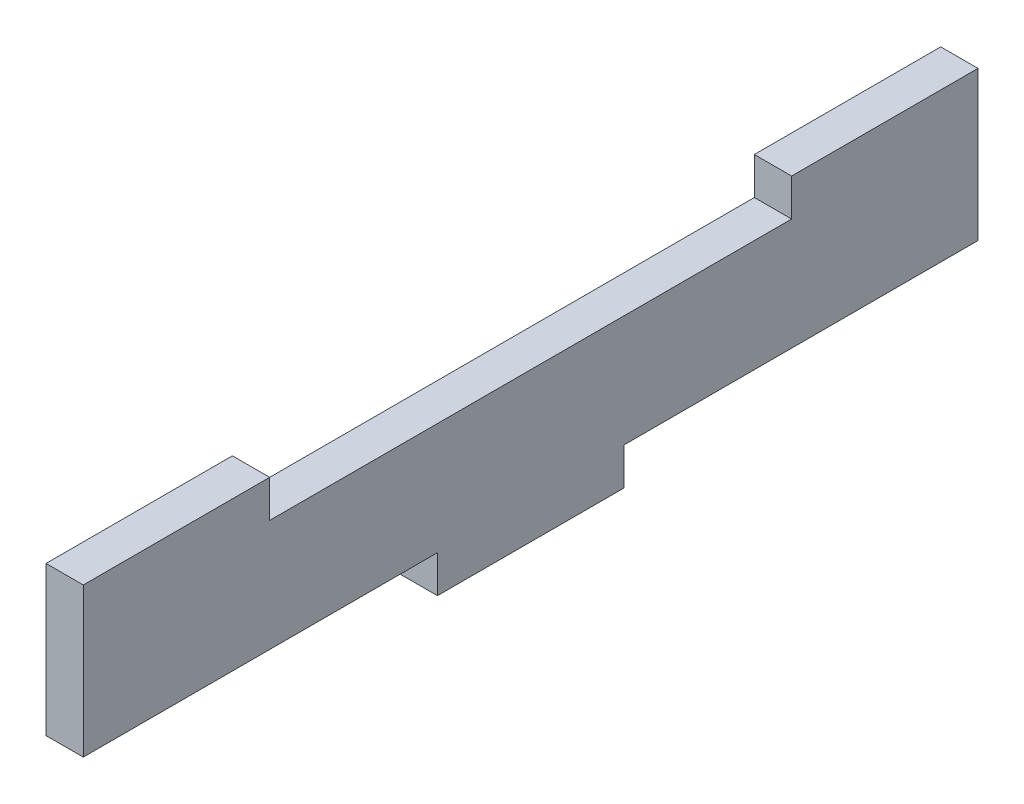
ISO-10303-21;
HEADER;
FILE_DESCRIPTION(('STEP AP214'),'2;1');
FILE_NAME('part.step','',(''),(''),'','','');
FILE_SCHEMA(('AUTOMOTIVE_DESIGN { 1 0 10303 214 1 1 1 1 }'));
ENDSEC;
DATA;
#1=APPLICATION_CONTEXT('core data for automotive mechanical design processes');
#2=APPLICATION_PROTOCOL_DEFINITION('international standard','automotive_design',2000,#1);
#3=PRODUCT_CONTEXT('',#1,'mechanical');
#4=PRODUCT('Part','Part','',(#3));
#5=PRODUCT_RELATED_PRODUCT_CATEGORY('part','',(#4));
#6=PRODUCT_DEFINITION_FORMATION('','',#4);
#7=PRODUCT_DEFINITION_CONTEXT('part definition',#1,'design');
#8=PRODUCT_DEFINITION('design','',#6,#7);
#9=PRODUCT_DEFINITION_SHAPE('','',#8);
#10=(LENGTH_UNIT() NAMED_UNIT(*) SI_UNIT(.MILLI.,.METRE.));
#11=(NAMED_UNIT(*) PLANE_ANGLE_UNIT() SI_UNIT($,.RADIAN.));
#12=(NAMED_UNIT(*) SI_UNIT($,.STERADIAN.) SOLID_ANGLE_UNIT());
#13=UNCERTAINTY_MEASURE_WITH_UNIT(LENGTH_MEASURE(1.E-05),#10,'distance_accuracy_value','');
#14=(GEOMETRIC_REPRESENTATION_CONTEXT(3) GLOBAL_UNCERTAINTY_ASSIGNED_CONTEXT((#13)) GLOBAL_UNIT_ASSIGNED_CONTEXT((#10,
#11,#12)) REPRESENTATION_CONTEXT('',''));
#15=CARTESIAN_POINT('',(0.,0.,0.));
#16=DIRECTION('',(0.,0.,1.));
#17=DIRECTION('',(1.,0.,0.));
#18=AXIS2_PLACEMENT_3D('',#15,#16,#17);
#19=CARTESIAN_POINT('',(5.,15.,120.));
#20=DIRECTION('',(0.,0.,-1.));
#21=DIRECTION('',(-1.,0.,0.));
#22=AXIS2_PLACEMENT_3D('',#19,#20,#21);
#23=PLANE('',#22);
#24=DIRECTION('',(0.,-1.,0.));
#25=VECTOR('',#24,1.);
#26=CARTESIAN_POINT('',(0.,15.,120.));
#27=LINE('',#26,#25);
#28=CARTESIAN_POINT('',(0.,20.,120.));
#29=VERTEX_POINT('',#28);
#30=CARTESIAN_POINT('',(0.,0.,120.));
#31=VERTEX_POINT('',#30);
#32=EDGE_CURVE('E99',#29,#31,#27,.T.);
#33=ORIENTED_EDGE('',*,*,#32,.T.);
#34=DIRECTION('',(-1.,0.,0.));
#35=VECTOR('',#34,1.);
#36=CARTESIAN_POINT('',(5.,0.,120.));
#37=LINE('',#36,#35);
#38=CARTESIAN_POINT('',(5.,0.,120.));
#39=VERTEX_POINT('',#38);
#40=EDGE_CURVE('E11',#39,#31,#37,.T.);
#41=ORIENTED_EDGE('',*,*,#40,.F.);
#42=DIRECTION('',(0.,-1.,0.));
#43=VECTOR('',#42,1.);
#44=CARTESIAN_POINT('',(5.,15.,120.));
#45=LINE('',#44,#43);
#46=CARTESIAN_POINT('',(5.,20.,120.));
#47=VERTEX_POINT('',#46);
#48=EDGE_CURVE('E105',#47,#39,#45,.T.);
#49=ORIENTED_EDGE('',*,*,#48,.F.);
#50=DIRECTION('',(-1.,0.,0.));
#51=VECTOR('',#50,1.);
#52=CARTESIAN_POINT('',(5.,20.,120.));
#53=LINE('',#52,#51);
#54=EDGE_CURVE('E151',#47,#29,#53,.T.);
#55=ORIENTED_EDGE('',*,*,#54,.T.);
#56=EDGE_LOOP('',(#33,#41,#49,#55));
#57=FACE_BOUND('',#56,.T.);
#58=ADVANCED_FACE('F35',(#57),#23,.F.);
#59=CARTESIAN_POINT('',(5.,0.,120.));
#60=DIRECTION('',(0.,1.,0.));
#61=DIRECTION('',(0.,0.,1.));
#62=AXIS2_PLACEMENT_3D('',#59,#60,#61);
#63=PLANE('',#62);
#64=DIRECTION('',(0.,0.,-1.));
#65=VECTOR('',#64,1.);
#66=CARTESIAN_POINT('',(0.,0.,120.));
#67=LINE('',#66,#65);
#68=CARTESIAN_POINT('',(0.,0.,72.5));
#69=VERTEX_POINT('',#68);
#70=EDGE_CURVE('E156',#31,#69,#67,.T.);
#71=ORIENTED_EDGE('',*,*,#70,.T.);
#72=DIRECTION('',(-1.,0.,0.));
#73=VECTOR('',#72,1.);
#74=CARTESIAN_POINT('',(5.,0.,72.5));
#75=LINE('',#74,#73);
#76=CARTESIAN_POINT('',(5.,0.,72.5));
#77=VERTEX_POINT('',#76);
#78=EDGE_CURVE('E43',#77,#69,#75,.T.);
#79=ORIENTED_EDGE('',*,*,#78,.F.);
#80=DIRECTION('',(0.,0.,-1.));
#81=VECTOR('',#80,1.);
#82=CARTESIAN_POINT('',(5.,0.,120.));
#83=LINE('',#82,#81);
#84=EDGE_CURVE('E245',#39,#77,#83,.T.);
#85=ORIENTED_EDGE('',*,*,#84,.F.);
#86=ORIENTED_EDGE('',*,*,#40,.T.);
#87=EDGE_LOOP('',(#71,#79,#85,#86));
#88=FACE_BOUND('',#87,.T.);
#89=ADVANCED_FACE('F248',(#88),#63,.F.);
#90=CARTESIAN_POINT('',(5.,0.,72.5));
#91=DIRECTION('',(0.,0.,-1.));
#92=DIRECTION('',(-1.,0.,0.));
#93=AXIS2_PLACEMENT_3D('',#90,#91,#92);
#94=PLANE('',#93);
#95=DIRECTION('',(0.,-1.,0.));
#96=VECTOR('',#95,1.);
#97=CARTESIAN_POINT('',(0.,0.,72.5));
#98=LINE('',#97,#96);
#99=CARTESIAN_POINT('',(0.,-5.,72.5));
#100=VERTEX_POINT('',#99);
#101=EDGE_CURVE('E158',#69,#100,#98,.T.);
#102=ORIENTED_EDGE('',*,*,#101,.T.);
#103=DIRECTION('',(-1.,0.,0.));
#104=VECTOR('',#103,1.);
#105=CARTESIAN_POINT('',(5.,-5.,72.5));
#106=LINE('',#105,#104);
#107=CARTESIAN_POINT('',(5.,-5.,72.5));
#108=VERTEX_POINT('',#107);
#109=EDGE_CURVE('E196',#108,#100,#106,.T.);
#110=ORIENTED_EDGE('',*,*,#109,.F.);
#111=DIRECTION('',(0.,-1.,0.));
#112=VECTOR('',#111,1.);
#113=CARTESIAN_POINT('',(5.,0.,72.5));
#114=LINE('',#113,#112);
#115=EDGE_CURVE('E205',#77,#108,#114,.T.);
#116=ORIENTED_EDGE('',*,*,#115,.F.);
#117=ORIENTED_EDGE('',*,*,#78,.T.);
#118=EDGE_LOOP('',(#102,#110,#116,#117));
#119=FACE_BOUND('',#118,.T.);
#120=ADVANCED_FACE('F203',(#119),#94,.F.);
#121=CARTESIAN_POINT('',(5.,-5.,72.5));
#122=DIRECTION('',(0.,1.,0.));
#123=DIRECTION('',(0.,0.,1.));
#124=AXIS2_PLACEMENT_3D('',#121,#122,#123);
#125=PLANE('',#124);
#126=DIRECTION('',(0.,0.,-1.));
#127=VECTOR('',#126,1.);
#128=CARTESIAN_POINT('',(0.,-5.,72.5));
#129=LINE('',#128,#127);
#130=CARTESIAN_POINT('',(0.,-5.,47.5));
#131=VERTEX_POINT('',#130);
#132=EDGE_CURVE('E160',#100,#131,#129,.T.);
#133=ORIENTED_EDGE('',*,*,#132,.T.);
#134=DIRECTION('',(-1.,0.,0.));
#135=VECTOR('',#134,1.);
#136=CARTESIAN_POINT('',(5.,-5.,47.5));
#137=LINE('',#136,#135);
#138=CARTESIAN_POINT('',(5.,-5.,47.5));
#139=VERTEX_POINT('',#138);
#140=EDGE_CURVE('E193',#139,#131,#137,.T.);
#141=ORIENTED_EDGE('',*,*,#140,.F.);
#142=DIRECTION('',(0.,0.,-1.));
#143=VECTOR('',#142,1.);
#144=CARTESIAN_POINT('',(5.,-5.,72.5));
#145=LINE('',#144,#143);
#146=EDGE_CURVE('E223',#108,#139,#145,.T.);
#147=ORIENTED_EDGE('',*,*,#146,.F.);
#148=ORIENTED_EDGE('',*,*,#109,.T.);
#149=EDGE_LOOP('',(#133,#141,#147,#148));
#150=FACE_BOUND('',#149,.T.);
#151=ADVANCED_FACE('F214',(#150),#125,.F.);
#152=CARTESIAN_POINT('',(5.,0.,47.5));
#153=DIRECTION('',(0.,0.,1.));
#154=DIRECTION('',(1.,0.,0.));
#155=AXIS2_PLACEMENT_3D('',#152,#153,#154);
#156=PLANE('',#155);
#157=DIRECTION('',(0.,1.,0.));
#158=VECTOR('',#157,1.);
#159=CARTESIAN_POINT('',(0.,0.,47.5));
#160=LINE('',#159,#158);
#161=CARTESIAN_POINT('',(0.,0.,47.5));
#162=VERTEX_POINT('',#161);
#163=EDGE_CURVE('E162',#131,#162,#160,.T.);
#164=ORIENTED_EDGE('',*,*,#163,.T.);
#165=DIRECTION('',(-1.,0.,0.));
#166=VECTOR('',#165,1.);
#167=CARTESIAN_POINT('',(5.,0.,47.5));
#168=LINE('',#167,#166);
#169=CARTESIAN_POINT('',(5.,0.,47.5));
#170=VERTEX_POINT('',#169);
#171=EDGE_CURVE('E190',#170,#162,#168,.T.);
#172=ORIENTED_EDGE('',*,*,#171,.F.);
#173=DIRECTION('',(0.,1.,0.));
#174=VECTOR('',#173,1.);
#175=CARTESIAN_POINT('',(5.,0.,47.5));
#176=LINE('',#175,#174);
#177=EDGE_CURVE('E220',#139,#170,#176,.T.);
#178=ORIENTED_EDGE('',*,*,#177,.F.);
#179=ORIENTED_EDGE('',*,*,#140,.T.);
#180=EDGE_LOOP('',(#164,#172,#178,#179));
#181=FACE_BOUND('',#180,.T.);
#182=ADVANCED_FACE('F218',(#181),#156,.F.);
#183=CARTESIAN_POINT('',(5.,0.,47.5));
#184=DIRECTION('',(0.,1.,0.));
#185=DIRECTION('',(0.,0.,1.));
#186=AXIS2_PLACEMENT_3D('',#183,#184,#185);
#187=PLANE('',#186);
#188=DIRECTION('',(0.,0.,-1.));
#189=VECTOR('',#188,1.);
#190=CARTESIAN_POINT('',(0.,0.,47.5));
#191=LINE('',#190,#189);
#192=CARTESIAN_POINT('',(0.,0.,0.));
#193=VERTEX_POINT('',#192);
#194=EDGE_CURVE('E164',#162,#193,#191,.T.);
#195=ORIENTED_EDGE('',*,*,#194,.T.);
#196=DIRECTION('',(-1.,0.,0.));
#197=VECTOR('',#196,1.);
#198=CARTESIAN_POINT('',(5.,0.,0.));
#199=LINE('',#198,#197);
#200=CARTESIAN_POINT('',(5.,0.,0.));
#201=VERTEX_POINT('',#200);
#202=EDGE_CURVE('E187',#201,#193,#199,.T.);
#203=ORIENTED_EDGE('',*,*,#202,.F.);
#204=DIRECTION('',(0.,0.,-1.));
#205=VECTOR('',#204,1.);
#206=CARTESIAN_POINT('',(5.,0.,47.5));
#207=LINE('',#206,#205);
#208=EDGE_CURVE('E222',#170,#201,#207,.T.);
#209=ORIENTED_EDGE('',*,*,#208,.F.);
#210=ORIENTED_EDGE('',*,*,#171,.T.);
#211=EDGE_LOOP('',(#195,#203,#209,#210));
#212=FACE_BOUND('',#211,.T.);
#213=ADVANCED_FACE('F260',(#212),#187,.F.);
#214=CARTESIAN_POINT('',(5.,15.,0.));
#215=DIRECTION('',(0.,0.,1.));
#216=DIRECTION('',(1.,0.,0.));
#217=AXIS2_PLACEMENT_3D('',#214,#215,#216);
#218=PLANE('',#217);
#219=DIRECTION('',(0.,1.,0.));
#220=VECTOR('',#219,1.);
#221=CARTESIAN_POINT('',(0.,15.,0.));
#222=LINE('',#221,#220);
#223=CARTESIAN_POINT('',(0.,20.,0.));
#224=VERTEX_POINT('',#223);
#225=EDGE_CURVE('E167',#193,#224,#222,.T.);
#226=ORIENTED_EDGE('',*,*,#225,.T.);
#227=DIRECTION('',(-1.,0.,0.));
#228=VECTOR('',#227,1.);
#229=CARTESIAN_POINT('',(5.,20.,0.));
#230=LINE('',#229,#228);
#231=CARTESIAN_POINT('',(5.,20.,0.));
#232=VERTEX_POINT('',#231);
#233=EDGE_CURVE('E184',#232,#224,#230,.T.);
#234=ORIENTED_EDGE('',*,*,#233,.F.);
#235=DIRECTION('',(0.,1.,0.));
#236=VECTOR('',#235,1.);
#237=CARTESIAN_POINT('',(5.,15.,0.));
#238=LINE('',#237,#236);
#239=EDGE_CURVE('E225',#201,#232,#238,.T.);
#240=ORIENTED_EDGE('',*,*,#239,.F.);
#241=ORIENTED_EDGE('',*,*,#202,.T.);
#242=EDGE_LOOP('',(#226,#234,#240,#241));
#243=FACE_BOUND('',#242,.T.);
#244=ADVANCED_FACE('F263',(#243),#218,.F.);
#245=CARTESIAN_POINT('',(5.,20.,0.));
#246=DIRECTION('',(0.,-1.,0.));
#247=DIRECTION('',(0.,0.,-1.));
#248=AXIS2_PLACEMENT_3D('',#245,#246,#247);
#249=PLANE('',#248);
#250=DIRECTION('',(0.,0.,1.));
#251=VECTOR('',#250,1.);
#252=CARTESIAN_POINT('',(0.,20.,0.));
#253=LINE('',#252,#251);
#254=CARTESIAN_POINT('',(0.,20.,25.));
#255=VERTEX_POINT('',#254);
#256=EDGE_CURVE('E169',#224,#255,#253,.T.);
#257=ORIENTED_EDGE('',*,*,#256,.T.);
#258=DIRECTION('',(-1.,0.,0.));
#259=VECTOR('',#258,1.);
#260=CARTESIAN_POINT('',(5.,20.,25.));
#261=LINE('',#260,#259);
#262=CARTESIAN_POINT('',(5.,20.,25.));
#263=VERTEX_POINT('',#262);
#264=EDGE_CURVE('E181',#263,#255,#261,.T.);
#265=ORIENTED_EDGE('',*,*,#264,.F.);
#266=DIRECTION('',(0.,0.,1.));
#267=VECTOR('',#266,1.);
#268=CARTESIAN_POINT('',(5.,20.,0.));
#269=LINE('',#268,#267);
#270=EDGE_CURVE('E231',#232,#263,#269,.T.);
#271=ORIENTED_EDGE('',*,*,#270,.F.);
#272=ORIENTED_EDGE('',*,*,#233,.T.);
#273=EDGE_LOOP('',(#257,#265,#271,#272));
#274=FACE_BOUND('',#273,.T.);
#275=ADVANCED_FACE('F237',(#274),#249,.F.);
#276=CARTESIAN_POINT('',(5.,15.,25.));
#277=DIRECTION('',(0.,0.,-1.));
#278=DIRECTION('',(-1.,0.,0.));
#279=AXIS2_PLACEMENT_3D('',#276,#277,#278);
#280=PLANE('',#279);
#281=DIRECTION('',(0.,-1.,0.));
#282=VECTOR('',#281,1.);
#283=CARTESIAN_POINT('',(0.,15.,25.));
#284=LINE('',#283,#282);
#285=CARTESIAN_POINT('',(0.,15.,25.));
#286=VERTEX_POINT('',#285);
#287=EDGE_CURVE('E171',#255,#286,#284,.T.);
#288=ORIENTED_EDGE('',*,*,#287,.T.);
#289=DIRECTION('',(-1.,0.,0.));
#290=VECTOR('',#289,1.);
#291=CARTESIAN_POINT('',(5.,15.,25.));
#292=LINE('',#291,#290);
#293=CARTESIAN_POINT('',(5.,15.,25.));
#294=VERTEX_POINT('',#293);
#295=EDGE_CURVE('E146',#294,#286,#292,.T.);
#296=ORIENTED_EDGE('',*,*,#295,.F.);
#297=DIRECTION('',(0.,-1.,0.));
#298=VECTOR('',#297,1.);
#299=CARTESIAN_POINT('',(5.,15.,25.));
#300=LINE('',#299,#298);
#301=EDGE_CURVE('E137',#263,#294,#300,.T.);
#302=ORIENTED_EDGE('',*,*,#301,.F.);
#303=ORIENTED_EDGE('',*,*,#264,.T.);
#304=EDGE_LOOP('',(#288,#296,#302,#303));
#305=FACE_BOUND('',#304,.T.);
#306=ADVANCED_FACE('F241',(#305),#280,.F.);
#307=CARTESIAN_POINT('',(5.,15.,95.));
#308=DIRECTION('',(0.,-1.,0.));
#309=DIRECTION('',(0.,0.,-1.));
#310=AXIS2_PLACEMENT_3D('',#307,#308,#309);
#311=PLANE('',#310);
#312=DIRECTION('',(0.,0.,1.));
#313=VECTOR('',#312,1.);
#314=CARTESIAN_POINT('',(0.,15.,95.));
#315=LINE('',#314,#313);
#316=CARTESIAN_POINT('',(0.,15.,95.));
#317=VERTEX_POINT('',#316);
#318=EDGE_CURVE('E145',#286,#317,#315,.T.);
#319=ORIENTED_EDGE('',*,*,#318,.T.);
#320=DIRECTION('',(-1.,0.,0.));
#321=VECTOR('',#320,1.);
#322=CARTESIAN_POINT('',(5.,15.,95.));
#323=LINE('',#322,#321);
#324=CARTESIAN_POINT('',(5.,15.,95.));
#325=VERTEX_POINT('',#324);
#326=EDGE_CURVE('E142',#325,#317,#323,.T.);
#327=ORIENTED_EDGE('',*,*,#326,.F.);
#328=DIRECTION('',(0.,0.,1.));
#329=VECTOR('',#328,1.);
#330=CARTESIAN_POINT('',(5.,15.,95.));
#331=LINE('',#330,#329);
#332=EDGE_CURVE('E131',#294,#325,#331,.T.);
#333=ORIENTED_EDGE('',*,*,#332,.F.);
#334=ORIENTED_EDGE('',*,*,#295,.T.);
#335=EDGE_LOOP('',(#319,#327,#333,#334));
#336=FACE_BOUND('',#335,.T.);
#337=ADVANCED_FACE('F143',(#336),#311,.F.);
#338=CARTESIAN_POINT('',(5.,15.,95.));
#339=DIRECTION('',(0.,0.,1.));
#340=DIRECTION('',(1.,0.,0.));
#341=AXIS2_PLACEMENT_3D('',#338,#339,#340);
#342=PLANE('',#341);
#343=DIRECTION('',(0.,1.,0.));
#344=VECTOR('',#343,1.);
#345=CARTESIAN_POINT('',(0.,15.,95.));
#346=LINE('',#345,#344);
#347=CARTESIAN_POINT('',(0.,20.,95.));
#348=VERTEX_POINT('',#347);
#349=EDGE_CURVE('E92',#317,#348,#346,.T.);
#350=ORIENTED_EDGE('',*,*,#349,.T.);
#351=DIRECTION('',(-1.,0.,0.));
#352=VECTOR('',#351,1.);
#353=CARTESIAN_POINT('',(5.,20.,95.));
#354=LINE('',#353,#352);
#355=CARTESIAN_POINT('',(5.,20.,95.));
#356=VERTEX_POINT('',#355);
#357=EDGE_CURVE('E147',#356,#348,#354,.T.);
#358=ORIENTED_EDGE('',*,*,#357,.F.);
#359=DIRECTION('',(0.,1.,0.));
#360=VECTOR('',#359,1.);
#361=CARTESIAN_POINT('',(5.,15.,95.));
#362=LINE('',#361,#360);
#363=EDGE_CURVE('E135',#325,#356,#362,.T.);
#364=ORIENTED_EDGE('',*,*,#363,.F.);
#365=ORIENTED_EDGE('',*,*,#326,.T.);
#366=EDGE_LOOP('',(#350,#358,#364,#365));
#367=FACE_BOUND('',#366,.T.);
#368=ADVANCED_FACE('F149',(#367),#342,.F.);
#369=CARTESIAN_POINT('',(5.,20.,120.));
#370=DIRECTION('',(0.,-1.,0.));
#371=DIRECTION('',(0.,0.,-1.));
#372=AXIS2_PLACEMENT_3D('',#369,#370,#371);
#373=PLANE('',#372);
#374=DIRECTION('',(0.,0.,1.));
#375=VECTOR('',#374,1.);
#376=CARTESIAN_POINT('',(0.,20.,120.));
#377=LINE('',#376,#375);
#378=EDGE_CURVE('E175',#348,#29,#377,.T.);
#379=ORIENTED_EDGE('',*,*,#378,.T.);
#380=ORIENTED_EDGE('',*,*,#54,.F.);
#381=DIRECTION('',(0.,0.,1.));
#382=VECTOR('',#381,1.);
#383=CARTESIAN_POINT('',(5.,20.,120.));
#384=LINE('',#383,#382);
#385=EDGE_CURVE('E51',#356,#47,#384,.T.);
#386=ORIENTED_EDGE('',*,*,#385,.F.);
#387=ORIENTED_EDGE('',*,*,#357,.T.);
#388=EDGE_LOOP('',(#379,#380,#386,#387));
#389=FACE_BOUND('',#388,.T.);
#390=ADVANCED_FACE('F243',(#389),#373,.F.);
#391=CARTESIAN_POINT('',(5.,0.,0.));
#392=DIRECTION('',(-1.,0.,0.));
#393=DIRECTION('',(0.,0.,1.));
#394=AXIS2_PLACEMENT_3D('',#391,#392,#393);
#395=PLANE('',#394);
#396=ORIENTED_EDGE('',*,*,#48,.T.);
#397=ORIENTED_EDGE('',*,*,#84,.T.);
#398=ORIENTED_EDGE('',*,*,#115,.T.);
#399=ORIENTED_EDGE('',*,*,#146,.T.);
#400=ORIENTED_EDGE('',*,*,#177,.T.);
#401=ORIENTED_EDGE('',*,*,#208,.T.);
#402=ORIENTED_EDGE('',*,*,#239,.T.);
#403=ORIENTED_EDGE('',*,*,#270,.T.);
#404=ORIENTED_EDGE('',*,*,#301,.T.);
#405=ORIENTED_EDGE('',*,*,#332,.T.);
#406=ORIENTED_EDGE('',*,*,#363,.T.);
#407=ORIENTED_EDGE('',*,*,#385,.T.);
#408=EDGE_LOOP('',(#396,#397,#398,#399,#400,#401,#402,#403,#404,#405,#406,#407));
#409=FACE_BOUND('',#408,.T.);
#410=ADVANCED_FACE('F133',(#409),#395,.F.);
#411=CARTESIAN_POINT('',(0.,0.,0.));
#412=DIRECTION('',(-1.,0.,0.));
#413=DIRECTION('',(0.,0.,1.));
#414=AXIS2_PLACEMENT_3D('',#411,#412,#413);
#415=PLANE('',#414);
#416=ORIENTED_EDGE('',*,*,#32,.F.);
#417=ORIENTED_EDGE('',*,*,#378,.F.);
#418=ORIENTED_EDGE('',*,*,#349,.F.);
#419=ORIENTED_EDGE('',*,*,#318,.F.);
#420=ORIENTED_EDGE('',*,*,#287,.F.);
#421=ORIENTED_EDGE('',*,*,#256,.F.);
#422=ORIENTED_EDGE('',*,*,#225,.F.);
#423=ORIENTED_EDGE('',*,*,#194,.F.);
#424=ORIENTED_EDGE('',*,*,#163,.F.);
#425=ORIENTED_EDGE('',*,*,#132,.F.);
#426=ORIENTED_EDGE('',*,*,#101,.F.);
#427=ORIENTED_EDGE('',*,*,#70,.F.);
#428=EDGE_LOOP('',(#416,#417,#418,#419,#420,#421,#422,#423,#424,#425,#426,#427));
#429=FACE_BOUND('',#428,.T.);
#430=ADVANCED_FACE('F209',(#429),#415,.T.);
#431=CLOSED_SHELL('',(#58,#89,#120,#151,#182,#213,#244,#275,#306,#337,#368,#390,#410,#430));
#432=MANIFOLD_SOLID_BREP('B2',#431);
#433=ADVANCED_BREP_SHAPE_REPRESENTATION('',(#18,#432),#14);
#434=SHAPE_DEFINITION_REPRESENTATION(#9,#433);
ENDSEC;
END-ISO-10303-21;
